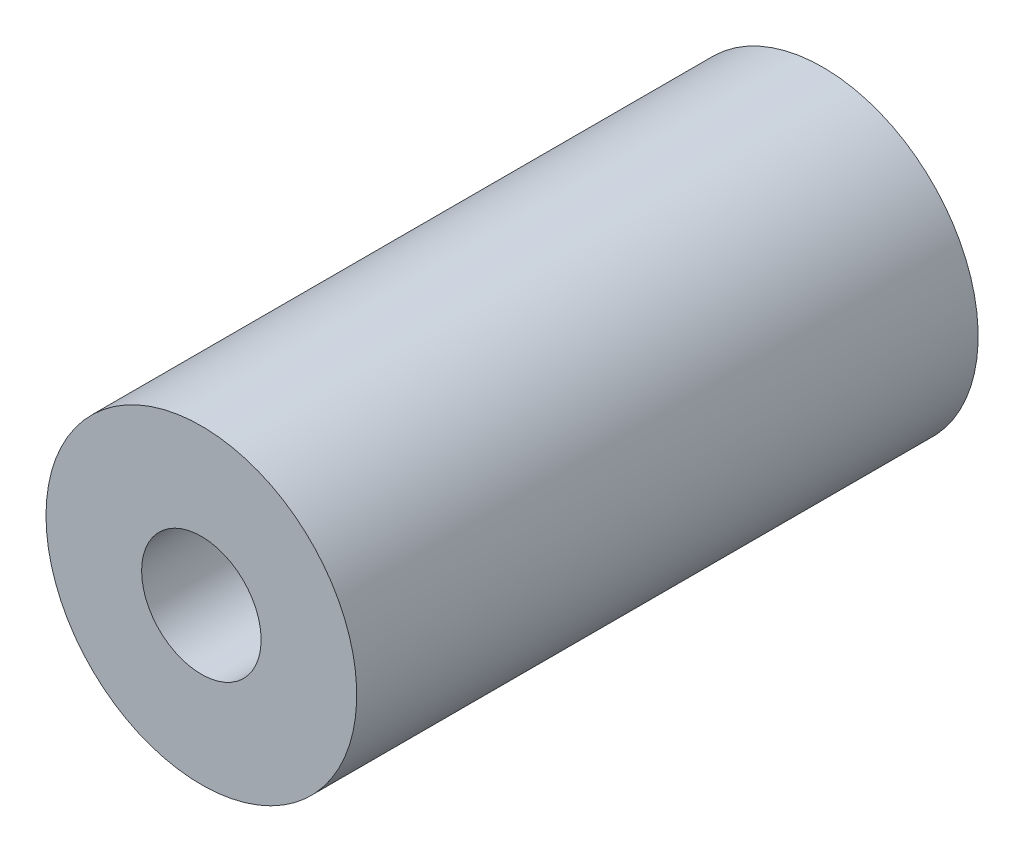
ISO-10303-21;
HEADER;
FILE_DESCRIPTION(('STEP AP214'),'2;1');
FILE_NAME('part.step','',(''),(''),'','','');
FILE_SCHEMA(('AUTOMOTIVE_DESIGN { 1 0 10303 214 1 1 1 1 }'));
ENDSEC;
DATA;
#1=APPLICATION_CONTEXT('core data for automotive mechanical design processes');
#2=APPLICATION_PROTOCOL_DEFINITION('international standard','automotive_design',2000,#1);
#3=PRODUCT_CONTEXT('',#1,'mechanical');
#4=PRODUCT('Part','Part','',(#3));
#5=PRODUCT_RELATED_PRODUCT_CATEGORY('part','',(#4));
#6=PRODUCT_DEFINITION_FORMATION('','',#4);
#7=PRODUCT_DEFINITION_CONTEXT('part definition',#1,'design');
#8=PRODUCT_DEFINITION('design','',#6,#7);
#9=PRODUCT_DEFINITION_SHAPE('','',#8);
#10=(LENGTH_UNIT() NAMED_UNIT(*) SI_UNIT(.MILLI.,.METRE.));
#11=(NAMED_UNIT(*) PLANE_ANGLE_UNIT() SI_UNIT($,.RADIAN.));
#12=(NAMED_UNIT(*) SI_UNIT($,.STERADIAN.) SOLID_ANGLE_UNIT());
#13=UNCERTAINTY_MEASURE_WITH_UNIT(LENGTH_MEASURE(1.E-05),#10,'distance_accuracy_value','');
#14=(GEOMETRIC_REPRESENTATION_CONTEXT(3) GLOBAL_UNCERTAINTY_ASSIGNED_CONTEXT((#13)) GLOBAL_UNIT_ASSIGNED_CONTEXT((#10,
#11,#12)) REPRESENTATION_CONTEXT('',''));
#15=CARTESIAN_POINT('',(0.,0.,0.));
#16=DIRECTION('',(0.,0.,1.));
#17=DIRECTION('',(1.,0.,0.));
#18=AXIS2_PLACEMENT_3D('',#15,#16,#17);
#19=CARTESIAN_POINT('',(0.,0.,13.));
#20=DIRECTION('',(0.,0.,1.));
#21=DIRECTION('',(1.,0.,0.));
#22=AXIS2_PLACEMENT_3D('',#19,#20,#21);
#23=PLANE('',#22);
#24=CARTESIAN_POINT('',(0.,0.,13.));
#25=DIRECTION('',(0.,0.,1.));
#26=DIRECTION('',(1.,0.,0.));
#27=AXIS2_PLACEMENT_3D('',#24,#25,#26);
#28=CIRCLE('',#27,3.25);
#29=CARTESIAN_POINT('',(-3.25,0.,13.));
#30=VERTEX_POINT('',#29);
#31=EDGE_CURVE('E10',#30,#30,#28,.T.);
#32=ORIENTED_EDGE('',*,*,#31,.T.);
#33=EDGE_LOOP('',(#32));
#34=FACE_BOUND('',#33,.T.);
#35=CARTESIAN_POINT('',(0.,0.,13.));
#36=DIRECTION('',(0.,0.,1.));
#37=DIRECTION('',(1.,0.,0.));
#38=AXIS2_PLACEMENT_3D('',#35,#36,#37);
#39=CIRCLE('',#38,1.25);
#40=CARTESIAN_POINT('',(-1.25,0.,13.));
#41=VERTEX_POINT('',#40);
#42=EDGE_CURVE('E45',#41,#41,#39,.T.);
#43=ORIENTED_EDGE('',*,*,#42,.F.);
#44=EDGE_LOOP('',(#43));
#45=FACE_BOUND('',#44,.T.);
#46=ADVANCED_FACE('F34',(#34,#45),#23,.T.);
#47=CARTESIAN_POINT('',(0.,0.,0.));
#48=DIRECTION('',(0.,0.,1.));
#49=DIRECTION('',(1.,0.,0.));
#50=AXIS2_PLACEMENT_3D('',#47,#48,#49);
#51=PLANE('',#50);
#52=CARTESIAN_POINT('',(0.,0.,0.));
#53=DIRECTION('',(0.,0.,1.));
#54=DIRECTION('',(1.,0.,0.));
#55=AXIS2_PLACEMENT_3D('',#52,#53,#54);
#56=CIRCLE('',#55,3.25);
#57=CARTESIAN_POINT('',(-3.25,0.,0.));
#58=VERTEX_POINT('',#57);
#59=EDGE_CURVE('E38',#58,#58,#56,.T.);
#60=ORIENTED_EDGE('',*,*,#59,.F.);
#61=EDGE_LOOP('',(#60));
#62=FACE_BOUND('',#61,.T.);
#63=CARTESIAN_POINT('',(0.,0.,0.));
#64=DIRECTION('',(0.,0.,1.));
#65=DIRECTION('',(1.,0.,0.));
#66=AXIS2_PLACEMENT_3D('',#63,#64,#65);
#67=CIRCLE('',#66,1.25);
#68=CARTESIAN_POINT('',(-1.25,0.,0.));
#69=VERTEX_POINT('',#68);
#70=EDGE_CURVE('E47',#69,#69,#67,.T.);
#71=ORIENTED_EDGE('',*,*,#70,.T.);
#72=EDGE_LOOP('',(#71));
#73=FACE_BOUND('',#72,.T.);
#74=ADVANCED_FACE('F57',(#62,#73),#51,.F.);
#75=CARTESIAN_POINT('',(0.,0.,13.));
#76=DIRECTION('',(0.,0.,-1.));
#77=DIRECTION('',(-1.,0.,0.));
#78=AXIS2_PLACEMENT_3D('',#75,#76,#77);
#79=CYLINDRICAL_SURFACE('',#78,3.25);
#80=CARTESIAN_POINT('',(-3.25,0.,13.));
#81=CARTESIAN_POINT('',(-3.25,0.,12.8645833333333));
#82=CARTESIAN_POINT('',(-3.25,0.,12.7291666666667));
#83=CARTESIAN_POINT('',(-3.25,0.,12.4583333333333));
#84=CARTESIAN_POINT('',(-3.25,0.,12.3229166666667));
#85=CARTESIAN_POINT('',(-3.25,0.,12.0520833333333));
#86=CARTESIAN_POINT('',(-3.25,0.,11.9166666666667));
#87=CARTESIAN_POINT('',(-3.25,0.,11.6458333333333));
#88=CARTESIAN_POINT('',(-3.25,0.,11.5104166666667));
#89=CARTESIAN_POINT('',(-3.25,0.,11.2395833333333));
#90=CARTESIAN_POINT('',(-3.25,0.,11.1041666666667));
#91=CARTESIAN_POINT('',(-3.25,0.,10.8333333333333));
#92=CARTESIAN_POINT('',(-3.25,0.,10.6979166666667));
#93=CARTESIAN_POINT('',(-3.25,0.,10.4270833333333));
#94=CARTESIAN_POINT('',(-3.25,0.,10.2916666666667));
#95=CARTESIAN_POINT('',(-3.25,0.,10.0208333333333));
#96=CARTESIAN_POINT('',(-3.25,0.,9.88541666666667));
#97=CARTESIAN_POINT('',(-3.25,0.,9.61458333333333));
#98=CARTESIAN_POINT('',(-3.25,0.,9.47916666666667));
#99=CARTESIAN_POINT('',(-3.25,0.,9.20833333333333));
#100=CARTESIAN_POINT('',(-3.25,0.,9.07291666666667));
#101=CARTESIAN_POINT('',(-3.25,0.,8.80208333333333));
#102=CARTESIAN_POINT('',(-3.25,0.,8.66666666666667));
#103=CARTESIAN_POINT('',(-3.25,0.,8.39583333333333));
#104=CARTESIAN_POINT('',(-3.25,0.,8.26041666666667));
#105=CARTESIAN_POINT('',(-3.25,0.,7.98958333333333));
#106=CARTESIAN_POINT('',(-3.25,0.,7.85416666666667));
#107=CARTESIAN_POINT('',(-3.25,0.,7.58333333333333));
#108=CARTESIAN_POINT('',(-3.25,0.,7.44791666666667));
#109=CARTESIAN_POINT('',(-3.25,0.,7.17708333333333));
#110=CARTESIAN_POINT('',(-3.25,0.,7.04166666666667));
#111=CARTESIAN_POINT('',(-3.25,0.,6.77083333333333));
#112=CARTESIAN_POINT('',(-3.25,0.,6.63541666666667));
#113=CARTESIAN_POINT('',(-3.25,0.,6.36458333333333));
#114=CARTESIAN_POINT('',(-3.25,0.,6.22916666666667));
#115=CARTESIAN_POINT('',(-3.25,0.,5.95833333333333));
#116=CARTESIAN_POINT('',(-3.25,0.,5.82291666666667));
#117=CARTESIAN_POINT('',(-3.25,0.,5.55208333333333));
#118=CARTESIAN_POINT('',(-3.25,0.,5.41666666666667));
#119=CARTESIAN_POINT('',(-3.25,0.,5.14583333333333));
#120=CARTESIAN_POINT('',(-3.25,0.,5.01041666666667));
#121=CARTESIAN_POINT('',(-3.25,0.,4.73958333333333));
#122=CARTESIAN_POINT('',(-3.25,0.,4.60416666666667));
#123=CARTESIAN_POINT('',(-3.25,0.,4.33333333333333));
#124=CARTESIAN_POINT('',(-3.25,0.,4.19791666666667));
#125=CARTESIAN_POINT('',(-3.25,0.,3.92708333333333));
#126=CARTESIAN_POINT('',(-3.25,0.,3.79166666666667));
#127=CARTESIAN_POINT('',(-3.25,0.,3.52083333333333));
#128=CARTESIAN_POINT('',(-3.25,0.,3.38541666666667));
#129=CARTESIAN_POINT('',(-3.25,0.,3.11458333333333));
#130=CARTESIAN_POINT('',(-3.25,0.,2.97916666666667));
#131=CARTESIAN_POINT('',(-3.25,0.,2.70833333333333));
#132=CARTESIAN_POINT('',(-3.25,0.,2.57291666666667));
#133=CARTESIAN_POINT('',(-3.25,0.,2.30208333333333));
#134=CARTESIAN_POINT('',(-3.25,0.,2.16666666666667));
#135=CARTESIAN_POINT('',(-3.25,0.,1.89583333333333));
#136=CARTESIAN_POINT('',(-3.25,0.,1.76041666666667));
#137=CARTESIAN_POINT('',(-3.25,0.,1.48958333333333));
#138=CARTESIAN_POINT('',(-3.25,0.,1.35416666666667));
#139=CARTESIAN_POINT('',(-3.25,0.,1.08333333333333));
#140=CARTESIAN_POINT('',(-3.25,0.,0.947916666666667));
#141=CARTESIAN_POINT('',(-3.25,0.,0.677083333333334));
#142=CARTESIAN_POINT('',(-3.25,0.,0.541666666666667));
#143=CARTESIAN_POINT('',(-3.25,0.,0.270833333333334));
#144=CARTESIAN_POINT('',(-3.25,0.,0.135416666666667));
#145=CARTESIAN_POINT('',(-3.25,0.,0.));
#146=B_SPLINE_CURVE_WITH_KNOTS('',3,(#80,#81,#82,#83,#84,#85,#86,#87,#88,#89,#90,#91,#92,#93,
#94,#95,#96,#97,#98,#99,#100,#101,#102,#103,#104,#105,#106,#107,#108,#109,#110,#111,#112,#113,
#114,#115,#116,#117,#118,#119,#120,#121,#122,#123,#124,#125,#126,#127,#128,#129,#130,#131,#132,
#133,#134,#135,#136,#137,#138,#139,#140,#141,#142,#143,#144,#145),.UNSPECIFIED.,.F.,.F.,(4,2,2,
2,2,2,2,2,2,2,2,2,2,2,2,2,2,2,2,2,2,2,2,2,2,2,2,2,2,2,2,2,4),(0.,0.406249999999999,
0.812499999999999,1.21875,1.625,2.03125,2.4375,2.84375,3.25,3.65625,4.0625,4.46875,4.875,
5.28125,5.6875,6.09375,6.5,6.90625,7.3125,7.71875,8.125,8.53125,8.9375,9.34375,9.75,10.15625,
10.5625,10.96875,11.375,11.78125,12.1875,12.59375,13.),.UNSPECIFIED.);
#147=EDGE_CURVE('BSEAM36',#30,#58,#146,.T.);
#148=ORIENTED_EDGE('',*,*,#31,.F.);
#149=ORIENTED_EDGE('',*,*,#59,.T.);
#150=ORIENTED_EDGE('',*,*,#147,.T.);
#151=ORIENTED_EDGE('',*,*,#147,.F.);
#152=EDGE_LOOP('',(#148,#150,#149,#151));
#153=FACE_BOUND('',#152,.T.);
#154=ADVANCED_FACE('F36',(#153),#79,.T.);
#155=CARTESIAN_POINT('',(0.,0.,13.));
#156=DIRECTION('',(0.,0.,-1.));
#157=DIRECTION('',(-1.,0.,0.));
#158=AXIS2_PLACEMENT_3D('',#155,#156,#157);
#159=CYLINDRICAL_SURFACE('',#158,1.25);
#160=CARTESIAN_POINT('',(-1.25,0.,13.));
#161=CARTESIAN_POINT('',(-1.25,0.,12.8645833333333));
#162=CARTESIAN_POINT('',(-1.25,0.,12.7291666666667));
#163=CARTESIAN_POINT('',(-1.25,0.,12.4583333333333));
#164=CARTESIAN_POINT('',(-1.25,0.,12.3229166666667));
#165=CARTESIAN_POINT('',(-1.25,0.,12.0520833333333));
#166=CARTESIAN_POINT('',(-1.25,0.,11.9166666666667));
#167=CARTESIAN_POINT('',(-1.25,0.,11.6458333333333));
#168=CARTESIAN_POINT('',(-1.25,0.,11.5104166666667));
#169=CARTESIAN_POINT('',(-1.25,0.,11.2395833333333));
#170=CARTESIAN_POINT('',(-1.25,0.,11.1041666666667));
#171=CARTESIAN_POINT('',(-1.25,0.,10.8333333333333));
#172=CARTESIAN_POINT('',(-1.25,0.,10.6979166666667));
#173=CARTESIAN_POINT('',(-1.25,0.,10.4270833333333));
#174=CARTESIAN_POINT('',(-1.25,0.,10.2916666666667));
#175=CARTESIAN_POINT('',(-1.25,0.,10.0208333333333));
#176=CARTESIAN_POINT('',(-1.25,0.,9.88541666666667));
#177=CARTESIAN_POINT('',(-1.25,0.,9.61458333333333));
#178=CARTESIAN_POINT('',(-1.25,0.,9.47916666666667));
#179=CARTESIAN_POINT('',(-1.25,0.,9.20833333333333));
#180=CARTESIAN_POINT('',(-1.25,0.,9.07291666666666));
#181=CARTESIAN_POINT('',(-1.25,0.,8.80208333333333));
#182=CARTESIAN_POINT('',(-1.25,0.,8.66666666666667));
#183=CARTESIAN_POINT('',(-1.25,0.,8.39583333333333));
#184=CARTESIAN_POINT('',(-1.25,0.,8.26041666666667));
#185=CARTESIAN_POINT('',(-1.25,0.,7.98958333333333));
#186=CARTESIAN_POINT('',(-1.25,0.,7.85416666666667));
#187=CARTESIAN_POINT('',(-1.25,0.,7.58333333333333));
#188=CARTESIAN_POINT('',(-1.25,0.,7.44791666666667));
#189=CARTESIAN_POINT('',(-1.25,0.,7.17708333333333));
#190=CARTESIAN_POINT('',(-1.25,0.,7.04166666666667));
#191=CARTESIAN_POINT('',(-1.25,0.,6.77083333333333));
#192=CARTESIAN_POINT('',(-1.25,0.,6.63541666666667));
#193=CARTESIAN_POINT('',(-1.25,0.,6.36458333333333));
#194=CARTESIAN_POINT('',(-1.25,0.,6.22916666666667));
#195=CARTESIAN_POINT('',(-1.25,0.,5.95833333333333));
#196=CARTESIAN_POINT('',(-1.25,0.,5.82291666666667));
#197=CARTESIAN_POINT('',(-1.25,0.,5.55208333333333));
#198=CARTESIAN_POINT('',(-1.25,0.,5.41666666666667));
#199=CARTESIAN_POINT('',(-1.25,0.,5.14583333333333));
#200=CARTESIAN_POINT('',(-1.25,0.,5.01041666666667));
#201=CARTESIAN_POINT('',(-1.25,0.,4.73958333333333));
#202=CARTESIAN_POINT('',(-1.25,0.,4.60416666666667));
#203=CARTESIAN_POINT('',(-1.25,0.,4.33333333333333));
#204=CARTESIAN_POINT('',(-1.25,0.,4.19791666666667));
#205=CARTESIAN_POINT('',(-1.25,0.,3.92708333333333));
#206=CARTESIAN_POINT('',(-1.25,0.,3.79166666666667));
#207=CARTESIAN_POINT('',(-1.25,0.,3.52083333333333));
#208=CARTESIAN_POINT('',(-1.25,0.,3.38541666666667));
#209=CARTESIAN_POINT('',(-1.25,0.,3.11458333333333));
#210=CARTESIAN_POINT('',(-1.25,0.,2.97916666666667));
#211=CARTESIAN_POINT('',(-1.25,0.,2.70833333333333));
#212=CARTESIAN_POINT('',(-1.25,0.,2.57291666666667));
#213=CARTESIAN_POINT('',(-1.25,0.,2.30208333333333));
#214=CARTESIAN_POINT('',(-1.25,0.,2.16666666666667));
#215=CARTESIAN_POINT('',(-1.25,0.,1.89583333333333));
#216=CARTESIAN_POINT('',(-1.25,0.,1.76041666666667));
#217=CARTESIAN_POINT('',(-1.25,0.,1.48958333333333));
#218=CARTESIAN_POINT('',(-1.25,0.,1.35416666666667));
#219=CARTESIAN_POINT('',(-1.25,0.,1.08333333333333));
#220=CARTESIAN_POINT('',(-1.25,0.,0.947916666666667));
#221=CARTESIAN_POINT('',(-1.25,0.,0.677083333333334));
#222=CARTESIAN_POINT('',(-1.25,0.,0.541666666666667));
#223=CARTESIAN_POINT('',(-1.25,0.,0.270833333333334));
#224=CARTESIAN_POINT('',(-1.25,0.,0.135416666666667));
#225=CARTESIAN_POINT('',(-1.25,0.,0.));
#226=B_SPLINE_CURVE_WITH_KNOTS('',3,(#160,#161,#162,#163,#164,#165,#166,#167,#168,#169,#170,
#171,#172,#173,#174,#175,#176,#177,#178,#179,#180,#181,#182,#183,#184,#185,#186,#187,#188,#189,
#190,#191,#192,#193,#194,#195,#196,#197,#198,#199,#200,#201,#202,#203,#204,#205,#206,#207,#208,
#209,#210,#211,#212,#213,#214,#215,#216,#217,#218,#219,#220,#221,#222,#223,#224,#225),
.UNSPECIFIED.,.F.,.F.,(4,2,2,2,2,2,2,2,2,2,2,2,2,2,2,2,2,2,2,2,2,2,2,2,2,2,2,2,2,2,2,2,4),(0.,
0.40625,0.812500000000001,1.21875,1.625,2.03125,2.4375,2.84375,3.25,3.65625,4.0625,4.46875,
4.875,5.28125,5.6875,6.09375,6.5,6.90625,7.3125,7.71875,8.125,8.53125,8.9375,9.34375,9.75,
10.15625,10.5625,10.96875,11.375,11.78125,12.1875,12.59375,13.),.UNSPECIFIED.);
#227=EDGE_CURVE('BSEAM53',#41,#69,#226,.T.);
#228=ORIENTED_EDGE('',*,*,#42,.T.);
#229=ORIENTED_EDGE('',*,*,#70,.F.);
#230=ORIENTED_EDGE('',*,*,#227,.T.);
#231=ORIENTED_EDGE('',*,*,#227,.F.);
#232=EDGE_LOOP('',(#228,#230,#229,#231));
#233=FACE_BOUND('',#232,.T.);
#234=ADVANCED_FACE('F53',(#233),#159,.F.);
#235=CLOSED_SHELL('',(#46,#74,#154,#234));
#236=MANIFOLD_SOLID_BREP('B2',#235);
#237=ADVANCED_BREP_SHAPE_REPRESENTATION('',(#18,#236),#14);
#238=SHAPE_DEFINITION_REPRESENTATION(#9,#237);
ENDSEC;
END-ISO-10303-21;
